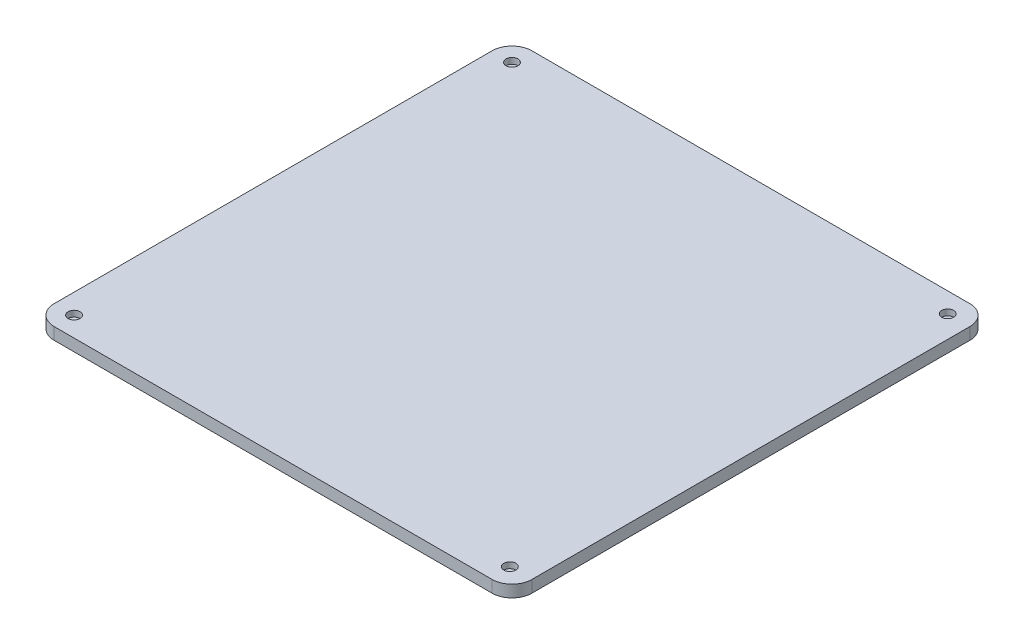
ISO-10303-21;
HEADER;
FILE_DESCRIPTION(('STEP AP214'),'2;1');
FILE_NAME('part.step','',(''),(''),'','','');
FILE_SCHEMA(('AUTOMOTIVE_DESIGN { 1 0 10303 214 1 1 1 1 }'));
ENDSEC;
DATA;
#1=APPLICATION_CONTEXT('core data for automotive mechanical design processes');
#2=APPLICATION_PROTOCOL_DEFINITION('international standard','automotive_design',2000,#1);
#3=PRODUCT_CONTEXT('',#1,'mechanical');
#4=PRODUCT('Part','Part','',(#3));
#5=PRODUCT_RELATED_PRODUCT_CATEGORY('part','',(#4));
#6=PRODUCT_DEFINITION_FORMATION('','',#4);
#7=PRODUCT_DEFINITION_CONTEXT('part definition',#1,'design');
#8=PRODUCT_DEFINITION('design','',#6,#7);
#9=PRODUCT_DEFINITION_SHAPE('','',#8);
#10=(LENGTH_UNIT() NAMED_UNIT(*) SI_UNIT(.MILLI.,.METRE.));
#11=(NAMED_UNIT(*) PLANE_ANGLE_UNIT() SI_UNIT($,.RADIAN.));
#12=(NAMED_UNIT(*) SI_UNIT($,.STERADIAN.) SOLID_ANGLE_UNIT());
#13=UNCERTAINTY_MEASURE_WITH_UNIT(LENGTH_MEASURE(1.E-05),#10,'distance_accuracy_value','');
#14=(GEOMETRIC_REPRESENTATION_CONTEXT(3) GLOBAL_UNCERTAINTY_ASSIGNED_CONTEXT((#13)) GLOBAL_UNIT_ASSIGNED_CONTEXT((#10,
#11,#12)) REPRESENTATION_CONTEXT('',''));
#15=CARTESIAN_POINT('',(0.,0.,0.));
#16=DIRECTION('',(0.,0.,1.));
#17=DIRECTION('',(1.,0.,0.));
#18=AXIS2_PLACEMENT_3D('',#15,#16,#17);
#19=CARTESIAN_POINT('',(60.,3.,60.));
#20=DIRECTION('',(-1.,0.,0.));
#21=DIRECTION('',(0.,0.,1.));
#22=AXIS2_PLACEMENT_3D('',#19,#20,#21);
#23=PLANE('',#22);
#24=DIRECTION('',(0.,0.,-1.));
#25=VECTOR('',#24,1.);
#26=CARTESIAN_POINT('',(60.,0.,60.));
#27=LINE('',#26,#25);
#28=CARTESIAN_POINT('',(60.,0.,55.));
#29=VERTEX_POINT('',#28);
#30=CARTESIAN_POINT('',(60.,0.,-55.));
#31=VERTEX_POINT('',#30);
#32=EDGE_CURVE('E132',#29,#31,#27,.T.);
#33=ORIENTED_EDGE('',*,*,#32,.T.);
#34=DIRECTION('',(0.,-1.,0.));
#35=VECTOR('',#34,1.);
#36=CARTESIAN_POINT('',(60.,3.,-55.));
#37=LINE('',#36,#35);
#38=CARTESIAN_POINT('',(60.,3.,-55.));
#39=VERTEX_POINT('',#38);
#40=EDGE_CURVE('E155',#31,#39,#37,.F.);
#41=ORIENTED_EDGE('',*,*,#40,.T.);
#42=DIRECTION('',(0.,0.,-1.));
#43=VECTOR('',#42,1.);
#44=CARTESIAN_POINT('',(60.,3.,60.));
#45=LINE('',#44,#43);
#46=CARTESIAN_POINT('',(60.,3.,55.));
#47=VERTEX_POINT('',#46);
#48=EDGE_CURVE('E130',#47,#39,#45,.T.);
#49=ORIENTED_EDGE('',*,*,#48,.F.);
#50=DIRECTION('',(0.,-1.,0.));
#51=VECTOR('',#50,1.);
#52=CARTESIAN_POINT('',(60.,3.,55.));
#53=LINE('',#52,#51);
#54=EDGE_CURVE('E152',#47,#29,#53,.T.);
#55=ORIENTED_EDGE('',*,*,#54,.T.);
#56=EDGE_LOOP('',(#33,#41,#49,#55));
#57=FACE_BOUND('',#56,.T.);
#58=ADVANCED_FACE('F37',(#57),#23,.F.);
#59=CARTESIAN_POINT('',(-60.,3.,-60.));
#60=DIRECTION('',(0.,0.,1.));
#61=DIRECTION('',(1.,0.,0.));
#62=AXIS2_PLACEMENT_3D('',#59,#60,#61);
#63=PLANE('',#62);
#64=DIRECTION('',(-1.,0.,0.));
#65=VECTOR('',#64,1.);
#66=CARTESIAN_POINT('',(-60.,0.,-60.));
#67=LINE('',#66,#65);
#68=CARTESIAN_POINT('',(55.,0.,-60.));
#69=VERTEX_POINT('',#68);
#70=CARTESIAN_POINT('',(-55.,0.,-60.));
#71=VERTEX_POINT('',#70);
#72=EDGE_CURVE('E128',#69,#71,#67,.T.);
#73=ORIENTED_EDGE('',*,*,#72,.T.);
#74=DIRECTION('',(0.,-1.,0.));
#75=VECTOR('',#74,1.);
#76=CARTESIAN_POINT('',(-55.,3.,-60.));
#77=LINE('',#76,#75);
#78=CARTESIAN_POINT('',(-55.,3.,-60.));
#79=VERTEX_POINT('',#78);
#80=EDGE_CURVE('E107',#71,#79,#77,.F.);
#81=ORIENTED_EDGE('',*,*,#80,.T.);
#82=DIRECTION('',(-1.,0.,0.));
#83=VECTOR('',#82,1.);
#84=CARTESIAN_POINT('',(-60.,3.,-60.));
#85=LINE('',#84,#83);
#86=CARTESIAN_POINT('',(55.,3.,-60.));
#87=VERTEX_POINT('',#86);
#88=EDGE_CURVE('E171',#87,#79,#85,.T.);
#89=ORIENTED_EDGE('',*,*,#88,.F.);
#90=DIRECTION('',(0.,-1.,0.));
#91=VECTOR('',#90,1.);
#92=CARTESIAN_POINT('',(55.,3.,-60.));
#93=LINE('',#92,#91);
#94=EDGE_CURVE('E112',#87,#69,#93,.T.);
#95=ORIENTED_EDGE('',*,*,#94,.T.);
#96=EDGE_LOOP('',(#73,#81,#89,#95));
#97=FACE_BOUND('',#96,.T.);
#98=ADVANCED_FACE('F216',(#97),#63,.F.);
#99=CARTESIAN_POINT('',(-60.,3.,60.));
#100=DIRECTION('',(1.,0.,0.));
#101=DIRECTION('',(0.,0.,-1.));
#102=AXIS2_PLACEMENT_3D('',#99,#100,#101);
#103=PLANE('',#102);
#104=DIRECTION('',(0.,0.,1.));
#105=VECTOR('',#104,1.);
#106=CARTESIAN_POINT('',(-60.,3.,60.));
#107=LINE('',#106,#105);
#108=CARTESIAN_POINT('',(-60.,3.,-55.));
#109=VERTEX_POINT('',#108);
#110=CARTESIAN_POINT('',(-60.,3.,55.));
#111=VERTEX_POINT('',#110);
#112=EDGE_CURVE('E121',#109,#111,#107,.T.);
#113=ORIENTED_EDGE('',*,*,#112,.F.);
#114=DIRECTION('',(0.,-1.,0.));
#115=VECTOR('',#114,1.);
#116=CARTESIAN_POINT('',(-60.,3.,-55.));
#117=LINE('',#116,#115);
#118=CARTESIAN_POINT('',(-60.,0.,-55.));
#119=VERTEX_POINT('',#118);
#120=EDGE_CURVE('E106',#109,#119,#117,.T.);
#121=ORIENTED_EDGE('',*,*,#120,.T.);
#122=DIRECTION('',(0.,0.,1.));
#123=VECTOR('',#122,1.);
#124=CARTESIAN_POINT('',(-60.,0.,60.));
#125=LINE('',#124,#123);
#126=CARTESIAN_POINT('',(-60.,0.,55.));
#127=VERTEX_POINT('',#126);
#128=EDGE_CURVE('E119',#119,#127,#125,.T.);
#129=ORIENTED_EDGE('',*,*,#128,.T.);
#130=DIRECTION('',(0.,-1.,0.));
#131=VECTOR('',#130,1.);
#132=CARTESIAN_POINT('',(-60.,3.,55.));
#133=LINE('',#132,#131);
#134=EDGE_CURVE('E123',#127,#111,#133,.F.);
#135=ORIENTED_EDGE('',*,*,#134,.T.);
#136=EDGE_LOOP('',(#113,#121,#129,#135));
#137=FACE_BOUND('',#136,.T.);
#138=ADVANCED_FACE('F118',(#137),#103,.F.);
#139=CARTESIAN_POINT('',(-60.,3.,60.));
#140=DIRECTION('',(0.,0.,-1.));
#141=DIRECTION('',(-1.,0.,0.));
#142=AXIS2_PLACEMENT_3D('',#139,#140,#141);
#143=PLANE('',#142);
#144=DIRECTION('',(1.,0.,0.));
#145=VECTOR('',#144,1.);
#146=CARTESIAN_POINT('',(-60.,0.,60.));
#147=LINE('',#146,#145);
#148=CARTESIAN_POINT('',(-55.,0.,60.));
#149=VERTEX_POINT('',#148);
#150=CARTESIAN_POINT('',(55.,0.,60.));
#151=VERTEX_POINT('',#150);
#152=EDGE_CURVE('E127',#149,#151,#147,.T.);
#153=ORIENTED_EDGE('',*,*,#152,.T.);
#154=DIRECTION('',(0.,-1.,0.));
#155=VECTOR('',#154,1.);
#156=CARTESIAN_POINT('',(55.,3.,60.));
#157=LINE('',#156,#155);
#158=CARTESIAN_POINT('',(55.,3.,60.));
#159=VERTEX_POINT('',#158);
#160=EDGE_CURVE('E11',#151,#159,#157,.F.);
#161=ORIENTED_EDGE('',*,*,#160,.T.);
#162=DIRECTION('',(1.,0.,0.));
#163=VECTOR('',#162,1.);
#164=CARTESIAN_POINT('',(-60.,3.,60.));
#165=LINE('',#164,#163);
#166=CARTESIAN_POINT('',(-55.,3.,60.));
#167=VERTEX_POINT('',#166);
#168=EDGE_CURVE('E136',#167,#159,#165,.T.);
#169=ORIENTED_EDGE('',*,*,#168,.F.);
#170=DIRECTION('',(0.,-1.,0.));
#171=VECTOR('',#170,1.);
#172=CARTESIAN_POINT('',(-55.,3.,60.));
#173=LINE('',#172,#171);
#174=EDGE_CURVE('E45',#167,#149,#173,.T.);
#175=ORIENTED_EDGE('',*,*,#174,.T.);
#176=EDGE_LOOP('',(#153,#161,#169,#175));
#177=FACE_BOUND('',#176,.T.);
#178=ADVANCED_FACE('F158',(#177),#143,.F.);
#179=CARTESIAN_POINT('',(0.,3.,0.));
#180=DIRECTION('',(0.,-1.,0.));
#181=DIRECTION('',(0.,0.,-1.));
#182=AXIS2_PLACEMENT_3D('',#179,#180,#181);
#183=PLANE('',#182);
#184=CARTESIAN_POINT('',(-55.,3.,55.));
#185=DIRECTION('',(0.,1.,0.));
#186=DIRECTION('',(0.,0.,1.));
#187=AXIS2_PLACEMENT_3D('',#184,#185,#186);
#188=CIRCLE('',#187,1.5);
#189=CARTESIAN_POINT('',(-55.,3.,56.5));
#190=VERTEX_POINT('',#189);
#191=EDGE_CURVE('E185',#190,#190,#188,.T.);
#192=ORIENTED_EDGE('',*,*,#191,.F.);
#193=EDGE_LOOP('',(#192));
#194=FACE_BOUND('',#193,.T.);
#195=CARTESIAN_POINT('',(54.4510892891756,3.,-55.));
#196=DIRECTION('',(0.,1.,0.));
#197=DIRECTION('',(0.,0.,1.));
#198=AXIS2_PLACEMENT_3D('',#195,#196,#197);
#199=CIRCLE('',#198,1.5);
#200=CARTESIAN_POINT('',(54.4510892891756,3.,-53.5));
#201=VERTEX_POINT('',#200);
#202=EDGE_CURVE('E190',#201,#201,#199,.T.);
#203=ORIENTED_EDGE('',*,*,#202,.F.);
#204=EDGE_LOOP('',(#203));
#205=FACE_BOUND('',#204,.T.);
#206=CARTESIAN_POINT('',(54.4510892891757,3.,55.));
#207=DIRECTION('',(0.,1.,0.));
#208=DIRECTION('',(0.,0.,1.));
#209=AXIS2_PLACEMENT_3D('',#206,#207,#208);
#210=CIRCLE('',#209,1.5);
#211=CARTESIAN_POINT('',(54.4510892891757,3.,56.5));
#212=VERTEX_POINT('',#211);
#213=EDGE_CURVE('E191',#212,#212,#210,.T.);
#214=ORIENTED_EDGE('',*,*,#213,.F.);
#215=EDGE_LOOP('',(#214));
#216=FACE_BOUND('',#215,.T.);
#217=CARTESIAN_POINT('',(-55.,3.,-55.));
#218=DIRECTION('',(0.,1.,0.));
#219=DIRECTION('',(0.,0.,1.));
#220=AXIS2_PLACEMENT_3D('',#217,#218,#219);
#221=CIRCLE('',#220,1.5);
#222=CARTESIAN_POINT('',(-55.,3.,-53.5));
#223=VERTEX_POINT('',#222);
#224=EDGE_CURVE('E176',#223,#223,#221,.T.);
#225=ORIENTED_EDGE('',*,*,#224,.F.);
#226=EDGE_LOOP('',(#225));
#227=FACE_BOUND('',#226,.T.);
#228=ORIENTED_EDGE('',*,*,#88,.T.);
#229=CARTESIAN_POINT('',(-55.,3.,-55.));
#230=DIRECTION('',(0.,-1.,0.));
#231=DIRECTION('',(0.,0.,-1.));
#232=AXIS2_PLACEMENT_3D('',#229,#230,#231);
#233=CIRCLE('',#232,5.);
#234=EDGE_CURVE('E150',#79,#109,#233,.F.);
#235=ORIENTED_EDGE('',*,*,#234,.T.);
#236=ORIENTED_EDGE('',*,*,#112,.T.);
#237=CARTESIAN_POINT('',(-55.,3.,55.));
#238=DIRECTION('',(0.,-1.,0.));
#239=DIRECTION('',(0.,0.,-1.));
#240=AXIS2_PLACEMENT_3D('',#237,#238,#239);
#241=CIRCLE('',#240,5.);
#242=EDGE_CURVE('E57',#111,#167,#241,.F.);
#243=ORIENTED_EDGE('',*,*,#242,.T.);
#244=ORIENTED_EDGE('',*,*,#168,.T.);
#245=CARTESIAN_POINT('',(55.,3.,55.));
#246=DIRECTION('',(0.,-1.,0.));
#247=DIRECTION('',(0.,0.,-1.));
#248=AXIS2_PLACEMENT_3D('',#245,#246,#247);
#249=CIRCLE('',#248,5.);
#250=EDGE_CURVE('E146',#159,#47,#249,.F.);
#251=ORIENTED_EDGE('',*,*,#250,.T.);
#252=ORIENTED_EDGE('',*,*,#48,.T.);
#253=CARTESIAN_POINT('',(55.,3.,-55.));
#254=DIRECTION('',(0.,-1.,0.));
#255=DIRECTION('',(0.,0.,-1.));
#256=AXIS2_PLACEMENT_3D('',#253,#254,#255);
#257=CIRCLE('',#256,5.);
#258=EDGE_CURVE('E148',#39,#87,#257,.F.);
#259=ORIENTED_EDGE('',*,*,#258,.T.);
#260=EDGE_LOOP('',(#228,#235,#236,#243,#244,#251,#252,#259));
#261=FACE_BOUND('',#260,.T.);
#262=ADVANCED_FACE('F207',(#194,#205,#216,#227,#261),#183,.F.);
#263=CARTESIAN_POINT('',(0.,0.,0.));
#264=DIRECTION('',(0.,-1.,0.));
#265=DIRECTION('',(0.,0.,-1.));
#266=AXIS2_PLACEMENT_3D('',#263,#264,#265);
#267=PLANE('',#266);
#268=ORIENTED_EDGE('',*,*,#128,.F.);
#269=CARTESIAN_POINT('',(-55.,0.,-55.));
#270=DIRECTION('',(0.,-1.,0.));
#271=DIRECTION('',(0.,0.,-1.));
#272=AXIS2_PLACEMENT_3D('',#269,#270,#271);
#273=CIRCLE('',#272,5.);
#274=EDGE_CURVE('E102',#119,#71,#273,.T.);
#275=ORIENTED_EDGE('',*,*,#274,.T.);
#276=ORIENTED_EDGE('',*,*,#72,.F.);
#277=CARTESIAN_POINT('',(55.,0.,-55.));
#278=DIRECTION('',(0.,-1.,0.));
#279=DIRECTION('',(0.,0.,-1.));
#280=AXIS2_PLACEMENT_3D('',#277,#278,#279);
#281=CIRCLE('',#280,5.);
#282=EDGE_CURVE('E113',#69,#31,#281,.T.);
#283=ORIENTED_EDGE('',*,*,#282,.T.);
#284=ORIENTED_EDGE('',*,*,#32,.F.);
#285=CARTESIAN_POINT('',(55.,0.,55.));
#286=DIRECTION('',(0.,-1.,0.));
#287=DIRECTION('',(0.,0.,-1.));
#288=AXIS2_PLACEMENT_3D('',#285,#286,#287);
#289=CIRCLE('',#288,5.);
#290=EDGE_CURVE('E139',#29,#151,#289,.T.);
#291=ORIENTED_EDGE('',*,*,#290,.T.);
#292=ORIENTED_EDGE('',*,*,#152,.F.);
#293=CARTESIAN_POINT('',(-55.,0.,55.));
#294=DIRECTION('',(0.,-1.,0.));
#295=DIRECTION('',(0.,0.,-1.));
#296=AXIS2_PLACEMENT_3D('',#293,#294,#295);
#297=CIRCLE('',#296,5.);
#298=EDGE_CURVE('E122',#149,#127,#297,.T.);
#299=ORIENTED_EDGE('',*,*,#298,.T.);
#300=EDGE_LOOP('',(#268,#275,#276,#283,#284,#291,#292,#299));
#301=FACE_BOUND('',#300,.T.);
#302=ADVANCED_FACE('F125',(#301),#267,.T.);
#303=CARTESIAN_POINT('',(-55.,3.,-55.));
#304=DIRECTION('',(0.,-1.,0.));
#305=DIRECTION('',(0.,0.,-1.));
#306=AXIS2_PLACEMENT_3D('',#303,#304,#305);
#307=CYLINDRICAL_SURFACE('',#306,5.);
#308=ORIENTED_EDGE('',*,*,#234,.F.);
#309=ORIENTED_EDGE('',*,*,#80,.F.);
#310=ORIENTED_EDGE('',*,*,#274,.F.);
#311=ORIENTED_EDGE('',*,*,#120,.F.);
#312=EDGE_LOOP('',(#308,#309,#310,#311));
#313=FACE_BOUND('',#312,.T.);
#314=ADVANCED_FACE('F105',(#313),#307,.T.);
#315=CARTESIAN_POINT('',(55.,3.,-55.));
#316=DIRECTION('',(0.,-1.,0.));
#317=DIRECTION('',(0.,0.,-1.));
#318=AXIS2_PLACEMENT_3D('',#315,#316,#317);
#319=CYLINDRICAL_SURFACE('',#318,5.);
#320=ORIENTED_EDGE('',*,*,#258,.F.);
#321=ORIENTED_EDGE('',*,*,#40,.F.);
#322=ORIENTED_EDGE('',*,*,#282,.F.);
#323=ORIENTED_EDGE('',*,*,#94,.F.);
#324=EDGE_LOOP('',(#320,#321,#322,#323));
#325=FACE_BOUND('',#324,.T.);
#326=ADVANCED_FACE('F218',(#325),#319,.T.);
#327=CARTESIAN_POINT('',(55.,3.,55.));
#328=DIRECTION('',(0.,-1.,0.));
#329=DIRECTION('',(0.,0.,-1.));
#330=AXIS2_PLACEMENT_3D('',#327,#328,#329);
#331=CYLINDRICAL_SURFACE('',#330,5.);
#332=ORIENTED_EDGE('',*,*,#250,.F.);
#333=ORIENTED_EDGE('',*,*,#160,.F.);
#334=ORIENTED_EDGE('',*,*,#290,.F.);
#335=ORIENTED_EDGE('',*,*,#54,.F.);
#336=EDGE_LOOP('',(#332,#333,#334,#335));
#337=FACE_BOUND('',#336,.T.);
#338=ADVANCED_FACE('F165',(#337),#331,.T.);
#339=CARTESIAN_POINT('',(-55.,3.,55.));
#340=DIRECTION('',(0.,-1.,0.));
#341=DIRECTION('',(0.,0.,-1.));
#342=AXIS2_PLACEMENT_3D('',#339,#340,#341);
#343=CYLINDRICAL_SURFACE('',#342,5.);
#344=ORIENTED_EDGE('',*,*,#242,.F.);
#345=ORIENTED_EDGE('',*,*,#134,.F.);
#346=ORIENTED_EDGE('',*,*,#298,.F.);
#347=ORIENTED_EDGE('',*,*,#174,.F.);
#348=EDGE_LOOP('',(#344,#345,#346,#347));
#349=FACE_BOUND('',#348,.T.);
#350=ADVANCED_FACE('F39',(#349),#343,.T.);
#351=CARTESIAN_POINT('',(-55.,1.5,-55.));
#352=DIRECTION('',(0.,1.,0.));
#353=DIRECTION('',(0.,0.,1.));
#354=AXIS2_PLACEMENT_3D('',#351,#352,#353);
#355=CYLINDRICAL_SURFACE('',#354,1.5);
#356=CARTESIAN_POINT('',(-55.,1.5,-55.));
#357=DIRECTION('',(0.,1.,0.));
#358=DIRECTION('',(0.,0.,1.));
#359=AXIS2_PLACEMENT_3D('',#356,#357,#358);
#360=CIRCLE('',#359,1.5);
#361=CARTESIAN_POINT('',(-55.,1.5,-53.5));
#362=VERTEX_POINT('',#361);
#363=EDGE_CURVE('E180',#362,#362,#360,.T.);
#364=ORIENTED_EDGE('',*,*,#363,.F.);
#365=EDGE_LOOP('',(#364));
#366=FACE_BOUND('',#365,.T.);
#367=ORIENTED_EDGE('',*,*,#224,.T.);
#368=EDGE_LOOP('',(#367));
#369=FACE_BOUND('',#368,.T.);
#370=ADVANCED_FACE('F239',(#366,#369),#355,.F.);
#371=CARTESIAN_POINT('',(-55.,1.5,-55.));
#372=DIRECTION('',(0.,1.,0.));
#373=DIRECTION('',(0.,0.,1.));
#374=AXIS2_PLACEMENT_3D('',#371,#372,#373);
#375=PLANE('',#374);
#376=ORIENTED_EDGE('',*,*,#363,.T.);
#377=EDGE_LOOP('',(#376));
#378=FACE_BOUND('',#377,.T.);
#379=ADVANCED_FACE('F242',(#378),#375,.T.);
#380=CARTESIAN_POINT('',(54.4510892891757,1.5,55.));
#381=DIRECTION('',(0.,1.,0.));
#382=DIRECTION('',(0.,0.,1.));
#383=AXIS2_PLACEMENT_3D('',#380,#381,#382);
#384=CYLINDRICAL_SURFACE('',#383,1.5);
#385=CARTESIAN_POINT('',(54.4510892891757,1.5,55.));
#386=DIRECTION('',(0.,1.,0.));
#387=DIRECTION('',(0.,0.,1.));
#388=AXIS2_PLACEMENT_3D('',#385,#386,#387);
#389=CIRCLE('',#388,1.5);
#390=CARTESIAN_POINT('',(54.4510892891757,1.5,56.5));
#391=VERTEX_POINT('',#390);
#392=EDGE_CURVE('E199',#391,#391,#389,.T.);
#393=ORIENTED_EDGE('',*,*,#392,.F.);
#394=EDGE_LOOP('',(#393));
#395=FACE_BOUND('',#394,.T.);
#396=ORIENTED_EDGE('',*,*,#213,.T.);
#397=EDGE_LOOP('',(#396));
#398=FACE_BOUND('',#397,.T.);
#399=ADVANCED_FACE('F205',(#395,#398),#384,.F.);
#400=CARTESIAN_POINT('',(54.4510892891757,1.5,55.));
#401=DIRECTION('',(0.,1.,0.));
#402=DIRECTION('',(0.,0.,1.));
#403=AXIS2_PLACEMENT_3D('',#400,#401,#402);
#404=PLANE('',#403);
#405=ORIENTED_EDGE('',*,*,#392,.T.);
#406=EDGE_LOOP('',(#405));
#407=FACE_BOUND('',#406,.T.);
#408=ADVANCED_FACE('F254',(#407),#404,.T.);
#409=CARTESIAN_POINT('',(54.4510892891756,1.5,-55.));
#410=DIRECTION('',(0.,1.,0.));
#411=DIRECTION('',(0.,0.,1.));
#412=AXIS2_PLACEMENT_3D('',#409,#410,#411);
#413=CYLINDRICAL_SURFACE('',#412,1.5);
#414=CARTESIAN_POINT('',(54.4510892891756,1.5,-55.));
#415=DIRECTION('',(0.,1.,0.));
#416=DIRECTION('',(0.,0.,1.));
#417=AXIS2_PLACEMENT_3D('',#414,#415,#416);
#418=CIRCLE('',#417,1.5);
#419=CARTESIAN_POINT('',(54.4510892891756,1.5,-53.5));
#420=VERTEX_POINT('',#419);
#421=EDGE_CURVE('E187',#420,#420,#418,.T.);
#422=ORIENTED_EDGE('',*,*,#421,.F.);
#423=EDGE_LOOP('',(#422));
#424=FACE_BOUND('',#423,.T.);
#425=ORIENTED_EDGE('',*,*,#202,.T.);
#426=EDGE_LOOP('',(#425));
#427=FACE_BOUND('',#426,.T.);
#428=ADVANCED_FACE('F250',(#424,#427),#413,.F.);
#429=CARTESIAN_POINT('',(54.4510892891756,1.5,-55.));
#430=DIRECTION('',(0.,1.,0.));
#431=DIRECTION('',(0.,0.,1.));
#432=AXIS2_PLACEMENT_3D('',#429,#430,#431);
#433=PLANE('',#432);
#434=ORIENTED_EDGE('',*,*,#421,.T.);
#435=EDGE_LOOP('',(#434));
#436=FACE_BOUND('',#435,.T.);
#437=ADVANCED_FACE('F246',(#436),#433,.T.);
#438=CARTESIAN_POINT('',(-55.,1.5,55.));
#439=DIRECTION('',(0.,1.,0.));
#440=DIRECTION('',(0.,0.,1.));
#441=AXIS2_PLACEMENT_3D('',#438,#439,#440);
#442=CYLINDRICAL_SURFACE('',#441,1.5);
#443=CARTESIAN_POINT('',(-55.,1.5,55.));
#444=DIRECTION('',(0.,1.,0.));
#445=DIRECTION('',(0.,0.,1.));
#446=AXIS2_PLACEMENT_3D('',#443,#444,#445);
#447=CIRCLE('',#446,1.5);
#448=CARTESIAN_POINT('',(-55.,1.5,56.5));
#449=VERTEX_POINT('',#448);
#450=EDGE_CURVE('E194',#449,#449,#447,.T.);
#451=ORIENTED_EDGE('',*,*,#450,.F.);
#452=EDGE_LOOP('',(#451));
#453=FACE_BOUND('',#452,.T.);
#454=ORIENTED_EDGE('',*,*,#191,.T.);
#455=EDGE_LOOP('',(#454));
#456=FACE_BOUND('',#455,.T.);
#457=ADVANCED_FACE('F249',(#453,#456),#442,.F.);
#458=CARTESIAN_POINT('',(-55.,1.5,55.));
#459=DIRECTION('',(0.,1.,0.));
#460=DIRECTION('',(0.,0.,1.));
#461=AXIS2_PLACEMENT_3D('',#458,#459,#460);
#462=PLANE('',#461);
#463=ORIENTED_EDGE('',*,*,#450,.T.);
#464=EDGE_LOOP('',(#463));
#465=FACE_BOUND('',#464,.T.);
#466=ADVANCED_FACE('F256',(#465),#462,.T.);
#467=CLOSED_SHELL('',(#58,#98,#138,#178,#262,#302,#314,#326,#338,#350,#370,#379,#399,#408,#428,
#437,#457,#466));
#468=MANIFOLD_SOLID_BREP('B2',#467);
#469=ADVANCED_BREP_SHAPE_REPRESENTATION('',(#18,#468),#14);
#470=SHAPE_DEFINITION_REPRESENTATION(#9,#469);
ENDSEC;
END-ISO-10303-21;
